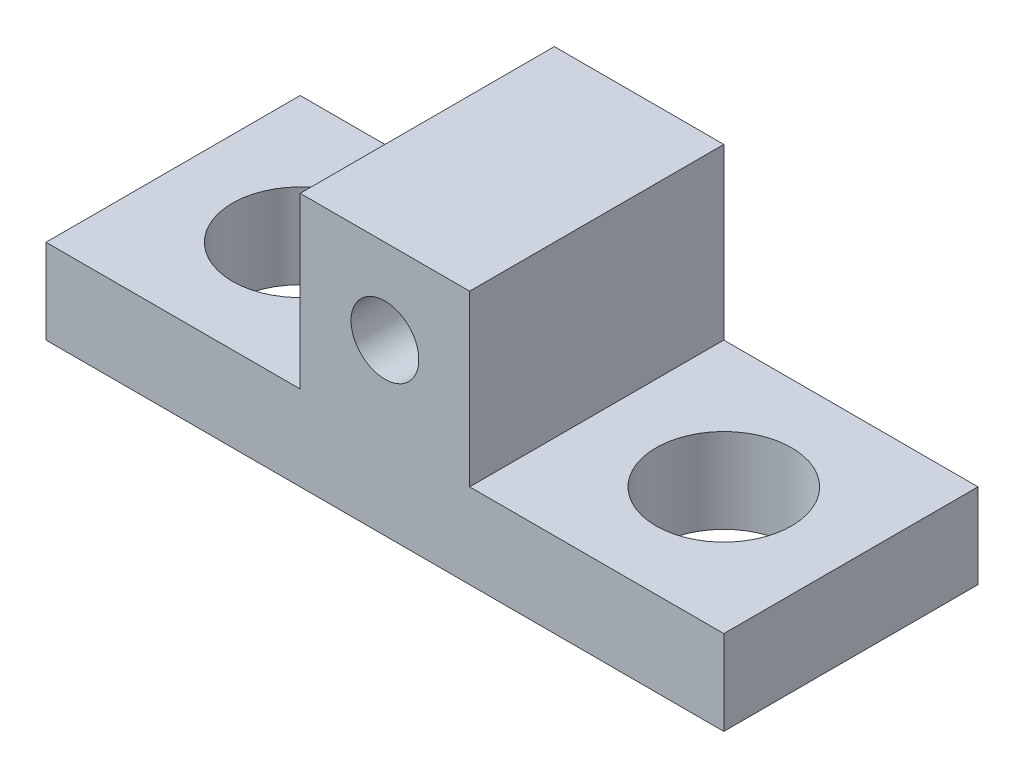
ISO-10303-21;
HEADER;
FILE_DESCRIPTION(('STEP AP214'),'2;1');
FILE_NAME('part.step','',(''),(''),'','','');
FILE_SCHEMA(('AUTOMOTIVE_DESIGN { 1 0 10303 214 1 1 1 1 }'));
ENDSEC;
DATA;
#1=APPLICATION_CONTEXT('core data for automotive mechanical design processes');
#2=APPLICATION_PROTOCOL_DEFINITION('international standard','automotive_design',2000,#1);
#3=PRODUCT_CONTEXT('',#1,'mechanical');
#4=PRODUCT('Part','Part','',(#3));
#5=PRODUCT_RELATED_PRODUCT_CATEGORY('part','',(#4));
#6=PRODUCT_DEFINITION_FORMATION('','',#4);
#7=PRODUCT_DEFINITION_CONTEXT('part definition',#1,'design');
#8=PRODUCT_DEFINITION('design','',#6,#7);
#9=PRODUCT_DEFINITION_SHAPE('','',#8);
#10=(LENGTH_UNIT() NAMED_UNIT(*) SI_UNIT(.MILLI.,.METRE.));
#11=(NAMED_UNIT(*) PLANE_ANGLE_UNIT() SI_UNIT($,.RADIAN.));
#12=(NAMED_UNIT(*) SI_UNIT($,.STERADIAN.) SOLID_ANGLE_UNIT());
#13=UNCERTAINTY_MEASURE_WITH_UNIT(LENGTH_MEASURE(1.E-05),#10,'distance_accuracy_value','');
#14=(GEOMETRIC_REPRESENTATION_CONTEXT(3) GLOBAL_UNCERTAINTY_ASSIGNED_CONTEXT((#13)) GLOBAL_UNIT_ASSIGNED_CONTEXT((#10,
#11,#12)) REPRESENTATION_CONTEXT('',''));
#15=CARTESIAN_POINT('',(0.,0.,0.));
#16=DIRECTION('',(0.,0.,1.));
#17=DIRECTION('',(1.,0.,0.));
#18=AXIS2_PLACEMENT_3D('',#15,#16,#17);
#19=CARTESIAN_POINT('',(0.,5.,0.));
#20=DIRECTION('',(0.,1.,0.));
#21=DIRECTION('',(0.,0.,1.));
#22=AXIS2_PLACEMENT_3D('',#19,#20,#21);
#23=PLANE('',#22);
#24=CARTESIAN_POINT('',(12.5,5.,0.));
#25=DIRECTION('',(0.,-1.,0.));
#26=DIRECTION('',(0.,0.,1.));
#27=AXIS2_PLACEMENT_3D('',#24,#25,#26);
#28=CIRCLE('',#27,4.);
#29=CARTESIAN_POINT('',(12.5,5.,4.));
#30=VERTEX_POINT('',#29);
#31=EDGE_CURVE('E228',#30,#30,#28,.T.);
#32=ORIENTED_EDGE('',*,*,#31,.T.);
#33=EDGE_LOOP('',(#32));
#34=FACE_BOUND('',#33,.T.);
#35=DIRECTION('',(0.,0.,-1.));
#36=VECTOR('',#35,1.);
#37=CARTESIAN_POINT('',(5.,5.,-7.5));
#38=LINE('',#37,#36);
#39=CARTESIAN_POINT('',(5.,5.,7.5));
#40=VERTEX_POINT('',#39);
#41=CARTESIAN_POINT('',(5.,5.,-7.5));
#42=VERTEX_POINT('',#41);
#43=EDGE_CURVE('E55',#40,#42,#38,.T.);
#44=ORIENTED_EDGE('',*,*,#43,.F.);
#45=DIRECTION('',(1.,0.,0.));
#46=VECTOR('',#45,1.);
#47=CARTESIAN_POINT('',(-20.,5.,7.5));
#48=LINE('',#47,#46);
#49=CARTESIAN_POINT('',(20.,5.,7.5));
#50=VERTEX_POINT('',#49);
#51=EDGE_CURVE('E152',#40,#50,#48,.T.);
#52=ORIENTED_EDGE('',*,*,#51,.T.);
#53=DIRECTION('',(0.,0.,-1.));
#54=VECTOR('',#53,1.);
#55=CARTESIAN_POINT('',(20.,5.,-7.5));
#56=LINE('',#55,#54);
#57=CARTESIAN_POINT('',(20.,5.,-7.5));
#58=VERTEX_POINT('',#57);
#59=EDGE_CURVE('E140',#50,#58,#56,.T.);
#60=ORIENTED_EDGE('',*,*,#59,.T.);
#61=DIRECTION('',(-1.,0.,0.));
#62=VECTOR('',#61,1.);
#63=CARTESIAN_POINT('',(-20.,5.,-7.5));
#64=LINE('',#63,#62);
#65=EDGE_CURVE('E146',#58,#42,#64,.T.);
#66=ORIENTED_EDGE('',*,*,#65,.T.);
#67=EDGE_LOOP('',(#44,#52,#60,#66));
#68=FACE_BOUND('',#67,.T.);
#69=ADVANCED_FACE('F39',(#34,#68),#23,.T.);
#70=CARTESIAN_POINT('',(20.,5.,-7.5));
#71=DIRECTION('',(-1.,0.,0.));
#72=DIRECTION('',(0.,0.,1.));
#73=AXIS2_PLACEMENT_3D('',#70,#71,#72);
#74=PLANE('',#73);
#75=DIRECTION('',(0.,0.,-1.));
#76=VECTOR('',#75,1.);
#77=CARTESIAN_POINT('',(20.,0.,-7.5));
#78=LINE('',#77,#76);
#79=CARTESIAN_POINT('',(20.,0.,7.5));
#80=VERTEX_POINT('',#79);
#81=CARTESIAN_POINT('',(20.,0.,-7.5));
#82=VERTEX_POINT('',#81);
#83=EDGE_CURVE('E129',#80,#82,#78,.T.);
#84=ORIENTED_EDGE('',*,*,#83,.T.);
#85=DIRECTION('',(0.,-1.,0.));
#86=VECTOR('',#85,1.);
#87=CARTESIAN_POINT('',(20.,5.,-7.5));
#88=LINE('',#87,#86);
#89=EDGE_CURVE('E11',#58,#82,#88,.T.);
#90=ORIENTED_EDGE('',*,*,#89,.F.);
#91=ORIENTED_EDGE('',*,*,#59,.F.);
#92=DIRECTION('',(0.,-1.,0.));
#93=VECTOR('',#92,1.);
#94=CARTESIAN_POINT('',(20.,5.,7.5));
#95=LINE('',#94,#93);
#96=EDGE_CURVE('E155',#50,#80,#95,.T.);
#97=ORIENTED_EDGE('',*,*,#96,.T.);
#98=EDGE_LOOP('',(#84,#90,#91,#97));
#99=FACE_BOUND('',#98,.T.);
#100=ADVANCED_FACE('F41',(#99),#74,.F.);
#101=CARTESIAN_POINT('',(-20.,5.,-7.5));
#102=DIRECTION('',(0.,0.,1.));
#103=DIRECTION('',(1.,0.,0.));
#104=AXIS2_PLACEMENT_3D('',#101,#102,#103);
#105=PLANE('',#104);
#106=CARTESIAN_POINT('',(0.,10.,-7.5));
#107=DIRECTION('',(0.,0.,-1.));
#108=DIRECTION('',(-1.,0.,0.));
#109=AXIS2_PLACEMENT_3D('',#106,#107,#108);
#110=CIRCLE('',#109,2.);
#111=CARTESIAN_POINT('',(-2.,10.,-7.5));
#112=VERTEX_POINT('',#111);
#113=EDGE_CURVE('E212',#112,#112,#110,.T.);
#114=ORIENTED_EDGE('',*,*,#113,.F.);
#115=EDGE_LOOP('',(#114));
#116=FACE_BOUND('',#115,.T.);
#117=DIRECTION('',(-1.,0.,0.));
#118=VECTOR('',#117,1.);
#119=CARTESIAN_POINT('',(-20.,0.,-7.5));
#120=LINE('',#119,#118);
#121=CARTESIAN_POINT('',(-20.,0.,-7.5));
#122=VERTEX_POINT('',#121);
#123=EDGE_CURVE('E134',#82,#122,#120,.T.);
#124=ORIENTED_EDGE('',*,*,#123,.T.);
#125=DIRECTION('',(0.,-1.,0.));
#126=VECTOR('',#125,1.);
#127=CARTESIAN_POINT('',(-20.,5.,-7.5));
#128=LINE('',#127,#126);
#129=CARTESIAN_POINT('',(-20.,5.,-7.5));
#130=VERTEX_POINT('',#129);
#131=EDGE_CURVE('E48',#130,#122,#128,.T.);
#132=ORIENTED_EDGE('',*,*,#131,.F.);
#133=CARTESIAN_POINT('',(-5.,5.,-7.5));
#134=VERTEX_POINT('',#133);
#135=EDGE_CURVE('E144',#134,#130,#64,.T.);
#136=ORIENTED_EDGE('',*,*,#135,.F.);
#137=DIRECTION('',(0.,-1.,0.));
#138=VECTOR('',#137,1.);
#139=CARTESIAN_POINT('',(-5.,15.,-7.5));
#140=LINE('',#139,#138);
#141=CARTESIAN_POINT('',(-5.,15.,-7.5));
#142=VERTEX_POINT('',#141);
#143=EDGE_CURVE('E111',#142,#134,#140,.T.);
#144=ORIENTED_EDGE('',*,*,#143,.F.);
#145=DIRECTION('',(-1.,0.,0.));
#146=VECTOR('',#145,1.);
#147=CARTESIAN_POINT('',(-5.,15.,-7.5));
#148=LINE('',#147,#146);
#149=CARTESIAN_POINT('',(5.,15.,-7.5));
#150=VERTEX_POINT('',#149);
#151=EDGE_CURVE('E105',#150,#142,#148,.T.);
#152=ORIENTED_EDGE('',*,*,#151,.F.);
#153=DIRECTION('',(0.,-1.,0.));
#154=VECTOR('',#153,1.);
#155=CARTESIAN_POINT('',(5.,15.,-7.5));
#156=LINE('',#155,#154);
#157=EDGE_CURVE('E109',#150,#42,#156,.T.);
#158=ORIENTED_EDGE('',*,*,#157,.T.);
#159=ORIENTED_EDGE('',*,*,#65,.F.);
#160=ORIENTED_EDGE('',*,*,#89,.T.);
#161=EDGE_LOOP('',(#124,#132,#136,#144,#152,#158,#159,#160));
#162=FACE_BOUND('',#161,.T.);
#163=ADVANCED_FACE('F107',(#116,#162),#105,.F.);
#164=CARTESIAN_POINT('',(-20.,5.,-7.5));
#165=DIRECTION('',(1.,0.,0.));
#166=DIRECTION('',(0.,0.,-1.));
#167=AXIS2_PLACEMENT_3D('',#164,#165,#166);
#168=PLANE('',#167);
#169=DIRECTION('',(0.,0.,1.));
#170=VECTOR('',#169,1.);
#171=CARTESIAN_POINT('',(-20.,0.,-7.5));
#172=LINE('',#171,#170);
#173=CARTESIAN_POINT('',(-20.,0.,7.5));
#174=VERTEX_POINT('',#173);
#175=EDGE_CURVE('E159',#122,#174,#172,.T.);
#176=ORIENTED_EDGE('',*,*,#175,.T.);
#177=DIRECTION('',(0.,-1.,0.));
#178=VECTOR('',#177,1.);
#179=CARTESIAN_POINT('',(-20.,5.,7.5));
#180=LINE('',#179,#178);
#181=CARTESIAN_POINT('',(-20.,5.,7.5));
#182=VERTEX_POINT('',#181);
#183=EDGE_CURVE('E167',#182,#174,#180,.T.);
#184=ORIENTED_EDGE('',*,*,#183,.F.);
#185=DIRECTION('',(0.,0.,1.));
#186=VECTOR('',#185,1.);
#187=CARTESIAN_POINT('',(-20.,5.,-7.5));
#188=LINE('',#187,#186);
#189=EDGE_CURVE('E149',#130,#182,#188,.T.);
#190=ORIENTED_EDGE('',*,*,#189,.F.);
#191=ORIENTED_EDGE('',*,*,#131,.T.);
#192=EDGE_LOOP('',(#176,#184,#190,#191));
#193=FACE_BOUND('',#192,.T.);
#194=ADVANCED_FACE('F176',(#193),#168,.F.);
#195=CARTESIAN_POINT('',(-20.,5.,7.5));
#196=DIRECTION('',(0.,0.,-1.));
#197=DIRECTION('',(-1.,0.,0.));
#198=AXIS2_PLACEMENT_3D('',#195,#196,#197);
#199=PLANE('',#198);
#200=CARTESIAN_POINT('',(0.,10.,7.5));
#201=DIRECTION('',(0.,0.,-1.));
#202=DIRECTION('',(-1.,0.,0.));
#203=AXIS2_PLACEMENT_3D('',#200,#201,#202);
#204=CIRCLE('',#203,2.);
#205=CARTESIAN_POINT('',(-2.,10.,7.5));
#206=VERTEX_POINT('',#205);
#207=EDGE_CURVE('E204',#206,#206,#204,.T.);
#208=ORIENTED_EDGE('',*,*,#207,.T.);
#209=EDGE_LOOP('',(#208));
#210=FACE_BOUND('',#209,.T.);
#211=DIRECTION('',(1.,0.,0.));
#212=VECTOR('',#211,1.);
#213=CARTESIAN_POINT('',(-20.,0.,7.5));
#214=LINE('',#213,#212);
#215=EDGE_CURVE('E145',#174,#80,#214,.T.);
#216=ORIENTED_EDGE('',*,*,#215,.T.);
#217=ORIENTED_EDGE('',*,*,#96,.F.);
#218=ORIENTED_EDGE('',*,*,#51,.F.);
#219=DIRECTION('',(0.,-1.,0.));
#220=VECTOR('',#219,1.);
#221=CARTESIAN_POINT('',(5.,15.,7.5));
#222=LINE('',#221,#220);
#223=CARTESIAN_POINT('',(5.,15.,7.5));
#224=VERTEX_POINT('',#223);
#225=EDGE_CURVE('E199',#224,#40,#222,.T.);
#226=ORIENTED_EDGE('',*,*,#225,.F.);
#227=DIRECTION('',(1.,0.,0.));
#228=VECTOR('',#227,1.);
#229=CARTESIAN_POINT('',(-5.,15.,7.5));
#230=LINE('',#229,#228);
#231=CARTESIAN_POINT('',(-5.,15.,7.5));
#232=VERTEX_POINT('',#231);
#233=EDGE_CURVE('E121',#232,#224,#230,.T.);
#234=ORIENTED_EDGE('',*,*,#233,.F.);
#235=DIRECTION('',(0.,-1.,0.));
#236=VECTOR('',#235,1.);
#237=CARTESIAN_POINT('',(-5.,15.,7.5));
#238=LINE('',#237,#236);
#239=CARTESIAN_POINT('',(-5.,5.,7.5));
#240=VERTEX_POINT('',#239);
#241=EDGE_CURVE('E136',#232,#240,#238,.T.);
#242=ORIENTED_EDGE('',*,*,#241,.T.);
#243=EDGE_CURVE('E153',#182,#240,#48,.T.);
#244=ORIENTED_EDGE('',*,*,#243,.F.);
#245=ORIENTED_EDGE('',*,*,#183,.T.);
#246=EDGE_LOOP('',(#216,#217,#218,#226,#234,#242,#244,#245));
#247=FACE_BOUND('',#246,.T.);
#248=ADVANCED_FACE('F184',(#210,#247),#199,.F.);
#249=CARTESIAN_POINT('',(-12.5,5.,0.));
#250=DIRECTION('',(0.,1.,0.));
#251=DIRECTION('',(0.,0.,1.));
#252=AXIS2_PLACEMENT_3D('',#249,#250,#251);
#253=CIRCLE('',#252,4.);
#254=CARTESIAN_POINT('',(-12.5,5.,4.));
#255=VERTEX_POINT('',#254);
#256=EDGE_CURVE('E220',#255,#255,#253,.T.);
#257=ORIENTED_EDGE('',*,*,#256,.F.);
#258=EDGE_LOOP('',(#257));
#259=FACE_BOUND('',#258,.T.);
#260=DIRECTION('',(0.,0.,1.));
#261=VECTOR('',#260,1.);
#262=CARTESIAN_POINT('',(-5.,5.,-7.5));
#263=LINE('',#262,#261);
#264=EDGE_CURVE('E63',#134,#240,#263,.T.);
#265=ORIENTED_EDGE('',*,*,#264,.F.);
#266=ORIENTED_EDGE('',*,*,#135,.T.);
#267=ORIENTED_EDGE('',*,*,#189,.T.);
#268=ORIENTED_EDGE('',*,*,#243,.T.);
#269=EDGE_LOOP('',(#265,#266,#267,#268));
#270=FACE_BOUND('',#269,.T.);
#271=ADVANCED_FACE('F191',(#259,#270),#23,.T.);
#272=CARTESIAN_POINT('',(0.,0.,0.));
#273=DIRECTION('',(0.,1.,0.));
#274=DIRECTION('',(0.,0.,1.));
#275=AXIS2_PLACEMENT_3D('',#272,#273,#274);
#276=PLANE('',#275);
#277=CARTESIAN_POINT('',(12.5,0.,0.));
#278=DIRECTION('',(0.,-1.,0.));
#279=DIRECTION('',(0.,0.,1.));
#280=AXIS2_PLACEMENT_3D('',#277,#278,#279);
#281=CIRCLE('',#280,4.);
#282=CARTESIAN_POINT('',(12.5,0.,4.));
#283=VERTEX_POINT('',#282);
#284=EDGE_CURVE('E224',#283,#283,#281,.T.);
#285=ORIENTED_EDGE('',*,*,#284,.F.);
#286=EDGE_LOOP('',(#285));
#287=FACE_BOUND('',#286,.T.);
#288=CARTESIAN_POINT('',(-12.5,0.,0.));
#289=DIRECTION('',(0.,1.,0.));
#290=DIRECTION('',(0.,0.,1.));
#291=AXIS2_PLACEMENT_3D('',#288,#289,#290);
#292=CIRCLE('',#291,4.);
#293=CARTESIAN_POINT('',(-12.5,0.,4.));
#294=VERTEX_POINT('',#293);
#295=EDGE_CURVE('E216',#294,#294,#292,.T.);
#296=ORIENTED_EDGE('',*,*,#295,.T.);
#297=EDGE_LOOP('',(#296));
#298=FACE_BOUND('',#297,.T.);
#299=ORIENTED_EDGE('',*,*,#83,.F.);
#300=ORIENTED_EDGE('',*,*,#215,.F.);
#301=ORIENTED_EDGE('',*,*,#175,.F.);
#302=ORIENTED_EDGE('',*,*,#123,.F.);
#303=EDGE_LOOP('',(#299,#300,#301,#302));
#304=FACE_BOUND('',#303,.T.);
#305=ADVANCED_FACE('F181',(#287,#298,#304),#276,.F.);
#306=CARTESIAN_POINT('',(5.,15.,-7.5));
#307=DIRECTION('',(-1.,0.,0.));
#308=DIRECTION('',(0.,0.,1.));
#309=AXIS2_PLACEMENT_3D('',#306,#307,#308);
#310=PLANE('',#309);
#311=ORIENTED_EDGE('',*,*,#43,.T.);
#312=ORIENTED_EDGE('',*,*,#157,.F.);
#313=DIRECTION('',(0.,0.,-1.));
#314=VECTOR('',#313,1.);
#315=CARTESIAN_POINT('',(5.,15.,-7.5));
#316=LINE('',#315,#314);
#317=EDGE_CURVE('E116',#224,#150,#316,.T.);
#318=ORIENTED_EDGE('',*,*,#317,.F.);
#319=ORIENTED_EDGE('',*,*,#225,.T.);
#320=EDGE_LOOP('',(#311,#312,#318,#319));
#321=FACE_BOUND('',#320,.T.);
#322=ADVANCED_FACE('F127',(#321),#310,.F.);
#323=CARTESIAN_POINT('',(-5.,15.,-7.5));
#324=DIRECTION('',(1.,0.,0.));
#325=DIRECTION('',(0.,0.,-1.));
#326=AXIS2_PLACEMENT_3D('',#323,#324,#325);
#327=PLANE('',#326);
#328=ORIENTED_EDGE('',*,*,#264,.T.);
#329=ORIENTED_EDGE('',*,*,#241,.F.);
#330=DIRECTION('',(0.,0.,1.));
#331=VECTOR('',#330,1.);
#332=CARTESIAN_POINT('',(-5.,15.,-7.5));
#333=LINE('',#332,#331);
#334=EDGE_CURVE('E115',#142,#232,#333,.T.);
#335=ORIENTED_EDGE('',*,*,#334,.F.);
#336=ORIENTED_EDGE('',*,*,#143,.T.);
#337=EDGE_LOOP('',(#328,#329,#335,#336));
#338=FACE_BOUND('',#337,.T.);
#339=ADVANCED_FACE('F193',(#338),#327,.F.);
#340=CARTESIAN_POINT('',(0.,15.,0.));
#341=DIRECTION('',(0.,1.,0.));
#342=DIRECTION('',(0.,0.,1.));
#343=AXIS2_PLACEMENT_3D('',#340,#341,#342);
#344=PLANE('',#343);
#345=ORIENTED_EDGE('',*,*,#317,.T.);
#346=ORIENTED_EDGE('',*,*,#151,.T.);
#347=ORIENTED_EDGE('',*,*,#334,.T.);
#348=ORIENTED_EDGE('',*,*,#233,.T.);
#349=EDGE_LOOP('',(#345,#346,#347,#348));
#350=FACE_BOUND('',#349,.T.);
#351=ADVANCED_FACE('F119',(#350),#344,.T.);
#352=CARTESIAN_POINT('',(0.,10.,7.5));
#353=DIRECTION('',(0.,0.,-1.));
#354=DIRECTION('',(-1.,0.,0.));
#355=AXIS2_PLACEMENT_3D('',#352,#353,#354);
#356=CYLINDRICAL_SURFACE('',#355,2.);
#357=ORIENTED_EDGE('',*,*,#207,.F.);
#358=EDGE_LOOP('',(#357));
#359=FACE_BOUND('',#358,.T.);
#360=ORIENTED_EDGE('',*,*,#113,.T.);
#361=EDGE_LOOP('',(#360));
#362=FACE_BOUND('',#361,.T.);
#363=ADVANCED_FACE('F243',(#359,#362),#356,.F.);
#364=CARTESIAN_POINT('',(-12.5,0.,0.));
#365=DIRECTION('',(0.,1.,0.));
#366=DIRECTION('',(0.,0.,1.));
#367=AXIS2_PLACEMENT_3D('',#364,#365,#366);
#368=CYLINDRICAL_SURFACE('',#367,4.);
#369=ORIENTED_EDGE('',*,*,#295,.F.);
#370=EDGE_LOOP('',(#369));
#371=FACE_BOUND('',#370,.T.);
#372=ORIENTED_EDGE('',*,*,#256,.T.);
#373=EDGE_LOOP('',(#372));
#374=FACE_BOUND('',#373,.T.);
#375=ADVANCED_FACE('F237',(#371,#374),#368,.F.);
#376=CARTESIAN_POINT('',(12.5,0.,0.));
#377=DIRECTION('',(0.,1.,0.));
#378=DIRECTION('',(0.,0.,1.));
#379=AXIS2_PLACEMENT_3D('',#376,#377,#378);
#380=CYLINDRICAL_SURFACE('',#379,4.);
#381=ORIENTED_EDGE('',*,*,#284,.T.);
#382=EDGE_LOOP('',(#381));
#383=FACE_BOUND('',#382,.T.);
#384=ORIENTED_EDGE('',*,*,#31,.F.);
#385=EDGE_LOOP('',(#384));
#386=FACE_BOUND('',#385,.T.);
#387=ADVANCED_FACE('F235',(#383,#386),#380,.F.);
#388=CLOSED_SHELL('',(#69,#100,#163,#194,#248,#271,#305,#322,#339,#351,#363,#375,#387));
#389=MANIFOLD_SOLID_BREP('B2',#388);
#390=ADVANCED_BREP_SHAPE_REPRESENTATION('',(#18,#389),#14);
#391=SHAPE_DEFINITION_REPRESENTATION(#9,#390);
ENDSEC;
END-ISO-10303-21;
